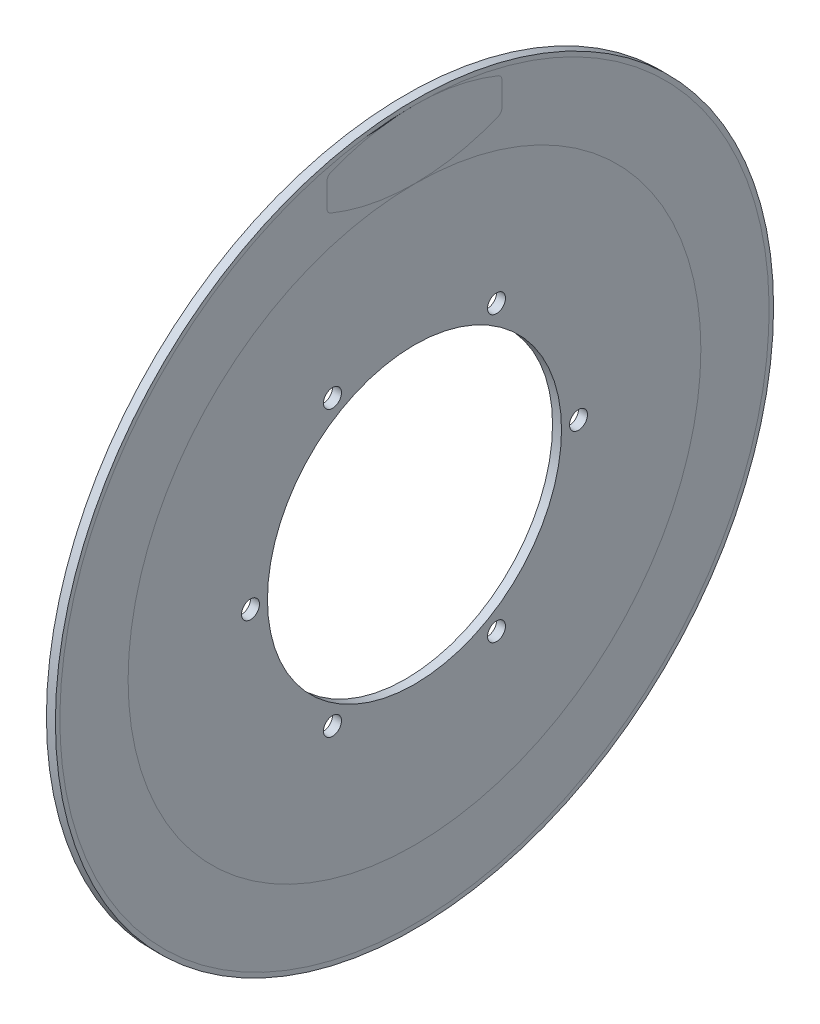
ISO-10303-21;
HEADER;
FILE_DESCRIPTION(('STEP AP214'),'2;1');
FILE_NAME('part.step','',(''),(''),'','','');
FILE_SCHEMA(('AUTOMOTIVE_DESIGN { 1 0 10303 214 1 1 1 1 }'));
ENDSEC;
DATA;
#1=APPLICATION_CONTEXT('core data for automotive mechanical design processes');
#2=APPLICATION_PROTOCOL_DEFINITION('international standard','automotive_design',2000,#1);
#3=PRODUCT_CONTEXT('',#1,'mechanical');
#4=PRODUCT('Part','Part','',(#3));
#5=PRODUCT_RELATED_PRODUCT_CATEGORY('part','',(#4));
#6=PRODUCT_DEFINITION_FORMATION('','',#4);
#7=PRODUCT_DEFINITION_CONTEXT('part definition',#1,'design');
#8=PRODUCT_DEFINITION('design','',#6,#7);
#9=PRODUCT_DEFINITION_SHAPE('','',#8);
#10=(LENGTH_UNIT() NAMED_UNIT(*) SI_UNIT(.MILLI.,.METRE.));
#11=(NAMED_UNIT(*) PLANE_ANGLE_UNIT() SI_UNIT($,.RADIAN.));
#12=(NAMED_UNIT(*) SI_UNIT($,.STERADIAN.) SOLID_ANGLE_UNIT());
#13=UNCERTAINTY_MEASURE_WITH_UNIT(LENGTH_MEASURE(1.E-05),#10,'distance_accuracy_value','');
#14=(GEOMETRIC_REPRESENTATION_CONTEXT(3) GLOBAL_UNCERTAINTY_ASSIGNED_CONTEXT((#13)) GLOBAL_UNIT_ASSIGNED_CONTEXT((#10,
#11,#12)) REPRESENTATION_CONTEXT('',''));
#15=CARTESIAN_POINT('',(0.,0.,0.));
#16=DIRECTION('',(0.,0.,1.));
#17=DIRECTION('',(1.,0.,0.));
#18=AXIS2_PLACEMENT_3D('',#15,#16,#17);
#19=CARTESIAN_POINT('',(0.,0.,0.));
#20=DIRECTION('',(1.,0.,0.));
#21=DIRECTION('',(0.,0.,-1.));
#22=AXIS2_PLACEMENT_3D('',#19,#20,#21);
#23=PLANE('',#22);
#24=CARTESIAN_POINT('',(0.,47.095998697923,0.));
#25=DIRECTION('',(1.,0.,0.));
#26=DIRECTION('',(0.,0.,-1.));
#27=AXIS2_PLACEMENT_3D('',#24,#25,#26);
#28=CIRCLE('',#27,78.316501302077);
#29=CARTESIAN_POINT('',(0.,125.4125,0.));
#30=VERTEX_POINT('',#29);
#31=CARTESIAN_POINT('',(0.,119.577602444939,-29.6629650314785));
#32=VERTEX_POINT('',#31);
#33=EDGE_CURVE('E174',#30,#32,#28,.F.);
#34=ORIENTED_EDGE('',*,*,#33,.F.);
#35=CARTESIAN_POINT('',(0.,0.,0.));
#36=DIRECTION('',(1.,0.,0.));
#37=DIRECTION('',(0.,0.,-1.));
#38=AXIS2_PLACEMENT_3D('',#35,#36,#37);
#39=CIRCLE('',#38,125.4125);
#40=EDGE_CURVE('E72',#30,#30,#39,.F.);
#41=ORIENTED_EDGE('',*,*,#40,.T.);
#42=CARTESIAN_POINT('',(0.,119.577602444939,29.6629650314786));
#43=VERTEX_POINT('',#42);
#44=EDGE_CURVE('E175',#43,#30,#28,.F.);
#45=ORIENTED_EDGE('',*,*,#44,.F.);
#46=CARTESIAN_POINT('',(0.,117.726610511915,28.905449936));
#47=DIRECTION('',(1.,0.,0.));
#48=DIRECTION('',(0.,0.,-1.));
#49=AXIS2_PLACEMENT_3D('',#46,#47,#48);
#50=CIRCLE('',#49,2.000000064);
#51=CARTESIAN_POINT('',(0.,117.726610511915,30.90545));
#52=VERTEX_POINT('',#51);
#53=EDGE_CURVE('E176',#52,#43,#50,.F.);
#54=ORIENTED_EDGE('',*,*,#53,.F.);
#55=DIRECTION('',(0.,1.,0.));
#56=VECTOR('',#55,1.);
#57=CARTESIAN_POINT('',(0.,0.,30.90545));
#58=LINE('',#57,#56);
#59=CARTESIAN_POINT('',(0.,109.019189402164,30.90545));
#60=VERTEX_POINT('',#59);
#61=EDGE_CURVE('E179',#60,#52,#58,.T.);
#62=ORIENTED_EDGE('',*,*,#61,.F.);
#63=CARTESIAN_POINT('',(0.,109.019189402164,28.905449936));
#64=DIRECTION('',(1.,0.,0.));
#65=DIRECTION('',(0.,0.,-1.));
#66=AXIS2_PLACEMENT_3D('',#63,#64,#65);
#67=CIRCLE('',#66,2.00000006400001);
#68=CARTESIAN_POINT('',(0.,107.168197469139,29.6629650314785));
#69=VERTEX_POINT('',#68);
#70=EDGE_CURVE('E183',#69,#60,#67,.F.);
#71=ORIENTED_EDGE('',*,*,#70,.F.);
#72=CARTESIAN_POINT('',(0.,179.649801216155,0.));
#73=DIRECTION('',(1.,0.,0.));
#74=DIRECTION('',(0.,0.,-1.));
#75=AXIS2_PLACEMENT_3D('',#72,#73,#74);
#76=CIRCLE('',#75,78.316501302077);
#77=CARTESIAN_POINT('',(0.,107.168197469139,-29.6629650314785));
#78=VERTEX_POINT('',#77);
#79=EDGE_CURVE('E189',#78,#69,#76,.F.);
#80=ORIENTED_EDGE('',*,*,#79,.F.);
#81=CARTESIAN_POINT('',(0.,109.019189402164,-28.905449936));
#82=DIRECTION('',(1.,0.,0.));
#83=DIRECTION('',(0.,0.,-1.));
#84=AXIS2_PLACEMENT_3D('',#81,#82,#83);
#85=CIRCLE('',#84,2.00000006400001);
#86=CARTESIAN_POINT('',(0.,109.019189402164,-30.90545));
#87=VERTEX_POINT('',#86);
#88=EDGE_CURVE('E195',#87,#78,#85,.F.);
#89=ORIENTED_EDGE('',*,*,#88,.F.);
#90=DIRECTION('',(0.,-1.,0.));
#91=VECTOR('',#90,1.);
#92=CARTESIAN_POINT('',(0.,0.,-30.9054500000001));
#93=LINE('',#92,#91);
#94=CARTESIAN_POINT('',(0.,117.726610511915,-30.90545));
#95=VERTEX_POINT('',#94);
#96=EDGE_CURVE('E134',#95,#87,#93,.T.);
#97=ORIENTED_EDGE('',*,*,#96,.F.);
#98=CARTESIAN_POINT('',(0.,117.726610511915,-28.905449936));
#99=DIRECTION('',(1.,0.,0.));
#100=DIRECTION('',(0.,0.,-1.));
#101=AXIS2_PLACEMENT_3D('',#98,#99,#100);
#102=CIRCLE('',#101,2.00000006400001);
#103=EDGE_CURVE('E169',#32,#95,#102,.F.);
#104=ORIENTED_EDGE('',*,*,#103,.F.);
#105=EDGE_LOOP('',(#34,#41,#45,#54,#62,#71,#80,#89,#97,#104));
#106=FACE_BOUND('',#105,.T.);
#107=CARTESIAN_POINT('',(0.,0.,0.));
#108=DIRECTION('',(1.,0.,0.));
#109=DIRECTION('',(0.,0.,-1.));
#110=AXIS2_PLACEMENT_3D('',#107,#108,#109);
#111=CIRCLE('',#110,101.2825);
#112=CARTESIAN_POINT('',(0.,0.,-101.2825));
#113=VERTEX_POINT('',#112);
#114=EDGE_CURVE('E11',#113,#113,#111,.F.);
#115=ORIENTED_EDGE('',*,*,#114,.F.);
#116=EDGE_LOOP('',(#115));
#117=FACE_BOUND('',#116,.T.);
#118=ADVANCED_FACE('F49',(#106,#117),#23,.F.);
#119=CARTESIAN_POINT('',(3.175,0.,0.));
#120=DIRECTION('',(1.,0.,0.));
#121=DIRECTION('',(0.,0.,-1.));
#122=AXIS2_PLACEMENT_3D('',#119,#120,#121);
#123=PLANE('',#122);
#124=CARTESIAN_POINT('',(3.175,47.095998697923,0.));
#125=DIRECTION('',(1.,0.,0.));
#126=DIRECTION('',(0.,0.,-1.));
#127=AXIS2_PLACEMENT_3D('',#124,#125,#126);
#128=CIRCLE('',#127,78.316501302077);
#129=CARTESIAN_POINT('',(3.175,119.577602444939,29.6629650314786));
#130=VERTEX_POINT('',#129);
#131=CARTESIAN_POINT('',(3.175,125.4125,0.));
#132=VERTEX_POINT('',#131);
#133=EDGE_CURVE('E131',#130,#132,#128,.F.);
#134=ORIENTED_EDGE('',*,*,#133,.T.);
#135=CARTESIAN_POINT('',(3.175,0.,0.));
#136=DIRECTION('',(1.,0.,0.));
#137=DIRECTION('',(0.,0.,-1.));
#138=AXIS2_PLACEMENT_3D('',#135,#136,#137);
#139=CIRCLE('',#138,125.4125);
#140=EDGE_CURVE('E69',#132,#132,#139,.F.);
#141=ORIENTED_EDGE('',*,*,#140,.F.);
#142=CARTESIAN_POINT('',(3.175,119.577602444939,-29.6629650314785));
#143=VERTEX_POINT('',#142);
#144=EDGE_CURVE('E127',#132,#143,#128,.F.);
#145=ORIENTED_EDGE('',*,*,#144,.T.);
#146=CARTESIAN_POINT('',(3.175,117.726610511915,-28.905449936));
#147=DIRECTION('',(1.,0.,0.));
#148=DIRECTION('',(0.,0.,-1.));
#149=AXIS2_PLACEMENT_3D('',#146,#147,#148);
#150=CIRCLE('',#149,2.00000006400001);
#151=CARTESIAN_POINT('',(3.175,117.726610511915,-30.90545));
#152=VERTEX_POINT('',#151);
#153=EDGE_CURVE('E122',#143,#152,#150,.F.);
#154=ORIENTED_EDGE('',*,*,#153,.T.);
#155=DIRECTION('',(0.,-1.,0.));
#156=VECTOR('',#155,1.);
#157=CARTESIAN_POINT('',(3.175,0.,-30.9054500000001));
#158=LINE('',#157,#156);
#159=CARTESIAN_POINT('',(3.175,109.019189402164,-30.90545));
#160=VERTEX_POINT('',#159);
#161=EDGE_CURVE('E126',#152,#160,#158,.T.);
#162=ORIENTED_EDGE('',*,*,#161,.T.);
#163=CARTESIAN_POINT('',(3.175,109.019189402164,-28.905449936));
#164=DIRECTION('',(1.,0.,0.));
#165=DIRECTION('',(0.,0.,-1.));
#166=AXIS2_PLACEMENT_3D('',#163,#164,#165);
#167=CIRCLE('',#166,2.00000006400001);
#168=CARTESIAN_POINT('',(3.175,107.168197469139,-29.6629650314785));
#169=VERTEX_POINT('',#168);
#170=EDGE_CURVE('E132',#160,#169,#167,.F.);
#171=ORIENTED_EDGE('',*,*,#170,.T.);
#172=CARTESIAN_POINT('',(3.175,179.649801216155,0.));
#173=DIRECTION('',(1.,0.,0.));
#174=DIRECTION('',(0.,0.,-1.));
#175=AXIS2_PLACEMENT_3D('',#172,#173,#174);
#176=CIRCLE('',#175,78.316501302077);
#177=CARTESIAN_POINT('',(3.175,107.168197469139,29.6629650314785));
#178=VERTEX_POINT('',#177);
#179=EDGE_CURVE('E141',#169,#178,#176,.F.);
#180=ORIENTED_EDGE('',*,*,#179,.T.);
#181=CARTESIAN_POINT('',(3.175,109.019189402164,28.905449936));
#182=DIRECTION('',(1.,0.,0.));
#183=DIRECTION('',(0.,0.,-1.));
#184=AXIS2_PLACEMENT_3D('',#181,#182,#183);
#185=CIRCLE('',#184,2.00000006400001);
#186=CARTESIAN_POINT('',(3.175,109.019189402164,30.90545));
#187=VERTEX_POINT('',#186);
#188=EDGE_CURVE('E152',#178,#187,#185,.F.);
#189=ORIENTED_EDGE('',*,*,#188,.T.);
#190=DIRECTION('',(0.,1.,0.));
#191=VECTOR('',#190,1.);
#192=CARTESIAN_POINT('',(3.175,0.,30.90545));
#193=LINE('',#192,#191);
#194=CARTESIAN_POINT('',(3.175,117.726610511915,30.90545));
#195=VERTEX_POINT('',#194);
#196=EDGE_CURVE('E158',#187,#195,#193,.T.);
#197=ORIENTED_EDGE('',*,*,#196,.T.);
#198=CARTESIAN_POINT('',(3.175,117.726610511915,28.905449936));
#199=DIRECTION('',(1.,0.,0.));
#200=DIRECTION('',(0.,0.,-1.));
#201=AXIS2_PLACEMENT_3D('',#198,#199,#200);
#202=CIRCLE('',#201,2.000000064);
#203=EDGE_CURVE('E161',#195,#130,#202,.F.);
#204=ORIENTED_EDGE('',*,*,#203,.T.);
#205=EDGE_LOOP('',(#134,#141,#145,#154,#162,#171,#180,#189,#197,#204));
#206=FACE_BOUND('',#205,.T.);
#207=CARTESIAN_POINT('',(3.175,0.,0.));
#208=DIRECTION('',(1.,0.,0.));
#209=DIRECTION('',(0.,0.,-1.));
#210=AXIS2_PLACEMENT_3D('',#207,#208,#209);
#211=CIRCLE('',#210,101.2825);
#212=CARTESIAN_POINT('',(3.175,0.,-101.2825));
#213=VERTEX_POINT('',#212);
#214=EDGE_CURVE('E53',#213,#213,#211,.F.);
#215=ORIENTED_EDGE('',*,*,#214,.T.);
#216=EDGE_LOOP('',(#215));
#217=FACE_BOUND('',#216,.T.);
#218=ADVANCED_FACE('F124',(#206,#217),#123,.T.);
#219=CARTESIAN_POINT('',(0.,0.,0.));
#220=DIRECTION('',(1.,0.,0.));
#221=DIRECTION('',(0.,0.,-1.));
#222=AXIS2_PLACEMENT_3D('',#219,#220,#221);
#223=CIRCLE('',#222,127.);
#224=CARTESIAN_POINT('',(0.,0.,-127.));
#225=VERTEX_POINT('',#224);
#226=EDGE_CURVE('E148',#225,#225,#223,.T.);
#227=ORIENTED_EDGE('',*,*,#226,.F.);
#228=EDGE_LOOP('',(#227));
#229=FACE_BOUND('',#228,.T.);
#230=ORIENTED_EDGE('',*,*,#40,.F.);
#231=EDGE_LOOP('',(#230));
#232=FACE_BOUND('',#231,.T.);
#233=ADVANCED_FACE('F307',(#229,#232),#23,.F.);
#234=CARTESIAN_POINT('',(3.175,0.,0.));
#235=DIRECTION('',(1.,0.,0.));
#236=DIRECTION('',(0.,0.,-1.));
#237=AXIS2_PLACEMENT_3D('',#234,#235,#236);
#238=CIRCLE('',#237,127.);
#239=CARTESIAN_POINT('',(3.175,0.,-127.));
#240=VERTEX_POINT('',#239);
#241=EDGE_CURVE('E140',#240,#240,#238,.T.);
#242=ORIENTED_EDGE('',*,*,#241,.T.);
#243=EDGE_LOOP('',(#242));
#244=FACE_BOUND('',#243,.T.);
#245=ORIENTED_EDGE('',*,*,#140,.T.);
#246=EDGE_LOOP('',(#245));
#247=FACE_BOUND('',#246,.T.);
#248=ADVANCED_FACE('F204',(#244,#247),#123,.T.);
#249=ORIENTED_EDGE('',*,*,#114,.T.);
#250=EDGE_LOOP('',(#249));
#251=FACE_BOUND('',#250,.T.);
#252=CARTESIAN_POINT('',(0.,50.2294734194975,29.));
#253=DIRECTION('',(1.,0.,0.));
#254=DIRECTION('',(0.,0.,-1.));
#255=AXIS2_PLACEMENT_3D('',#252,#253,#254);
#256=CIRCLE('',#255,3.175);
#257=CARTESIAN_POINT('',(0.,50.2294734194975,25.825));
#258=VERTEX_POINT('',#257);
#259=EDGE_CURVE('E285',#258,#258,#256,.T.);
#260=ORIENTED_EDGE('',*,*,#259,.T.);
#261=EDGE_LOOP('',(#260));
#262=FACE_BOUND('',#261,.T.);
#263=CARTESIAN_POINT('',(0.,-50.2294734194974,-29.));
#264=DIRECTION('',(1.,0.,0.));
#265=DIRECTION('',(0.,0.,-1.));
#266=AXIS2_PLACEMENT_3D('',#263,#264,#265);
#267=CIRCLE('',#266,3.175);
#268=CARTESIAN_POINT('',(0.,-50.2294734194974,-32.175));
#269=VERTEX_POINT('',#268);
#270=EDGE_CURVE('E284',#269,#269,#267,.T.);
#271=ORIENTED_EDGE('',*,*,#270,.T.);
#272=EDGE_LOOP('',(#271));
#273=FACE_BOUND('',#272,.T.);
#274=CARTESIAN_POINT('',(0.,-50.2294734194974,29.));
#275=DIRECTION('',(1.,0.,0.));
#276=DIRECTION('',(0.,0.,-1.));
#277=AXIS2_PLACEMENT_3D('',#274,#275,#276);
#278=CIRCLE('',#277,3.175);
#279=CARTESIAN_POINT('',(0.,-50.2294734194974,25.825));
#280=VERTEX_POINT('',#279);
#281=EDGE_CURVE('E277',#280,#280,#278,.T.);
#282=ORIENTED_EDGE('',*,*,#281,.T.);
#283=EDGE_LOOP('',(#282));
#284=FACE_BOUND('',#283,.T.);
#285=CARTESIAN_POINT('',(0.,0.,-58.));
#286=DIRECTION('',(1.,0.,0.));
#287=DIRECTION('',(0.,0.,-1.));
#288=AXIS2_PLACEMENT_3D('',#285,#286,#287);
#289=CIRCLE('',#288,3.175);
#290=CARTESIAN_POINT('',(0.,0.,-61.175));
#291=VERTEX_POINT('',#290);
#292=EDGE_CURVE('E273',#291,#291,#289,.T.);
#293=ORIENTED_EDGE('',*,*,#292,.T.);
#294=EDGE_LOOP('',(#293));
#295=FACE_BOUND('',#294,.T.);
#296=CARTESIAN_POINT('',(0.,0.,58.));
#297=DIRECTION('',(1.,0.,0.));
#298=DIRECTION('',(0.,0.,-1.));
#299=AXIS2_PLACEMENT_3D('',#296,#297,#298);
#300=CIRCLE('',#299,3.175);
#301=CARTESIAN_POINT('',(0.,0.,54.825));
#302=VERTEX_POINT('',#301);
#303=EDGE_CURVE('E275',#302,#302,#300,.T.);
#304=ORIENTED_EDGE('',*,*,#303,.T.);
#305=EDGE_LOOP('',(#304));
#306=FACE_BOUND('',#305,.T.);
#307=CARTESIAN_POINT('',(0.,50.2294734194975,-29.));
#308=DIRECTION('',(1.,0.,0.));
#309=DIRECTION('',(0.,0.,-1.));
#310=AXIS2_PLACEMENT_3D('',#307,#308,#309);
#311=CIRCLE('',#310,3.175);
#312=CARTESIAN_POINT('',(0.,50.2294734194975,-32.175));
#313=VERTEX_POINT('',#312);
#314=EDGE_CURVE('E268',#313,#313,#311,.T.);
#315=ORIENTED_EDGE('',*,*,#314,.T.);
#316=EDGE_LOOP('',(#315));
#317=FACE_BOUND('',#316,.T.);
#318=CARTESIAN_POINT('',(0.,0.,0.));
#319=DIRECTION('',(1.,0.,0.));
#320=DIRECTION('',(0.,0.,-1.));
#321=AXIS2_PLACEMENT_3D('',#318,#319,#320);
#322=CIRCLE('',#321,51.9999999999986);
#323=CARTESIAN_POINT('',(0.,0.,-51.9999999999986));
#324=VERTEX_POINT('',#323);
#325=EDGE_CURVE('E266',#324,#324,#322,.T.);
#326=ORIENTED_EDGE('',*,*,#325,.T.);
#327=EDGE_LOOP('',(#326));
#328=FACE_BOUND('',#327,.T.);
#329=ADVANCED_FACE('F231',(#251,#262,#273,#284,#295,#306,#317,#328),#23,.F.);
#330=ORIENTED_EDGE('',*,*,#214,.F.);
#331=EDGE_LOOP('',(#330));
#332=FACE_BOUND('',#331,.T.);
#333=CARTESIAN_POINT('',(3.175,0.,0.));
#334=DIRECTION('',(1.,0.,0.));
#335=DIRECTION('',(0.,0.,-1.));
#336=AXIS2_PLACEMENT_3D('',#333,#334,#335);
#337=CIRCLE('',#336,51.9999999999986);
#338=CARTESIAN_POINT('',(3.175,0.,-51.9999999999986));
#339=VERTEX_POINT('',#338);
#340=EDGE_CURVE('E238',#339,#339,#337,.T.);
#341=ORIENTED_EDGE('',*,*,#340,.F.);
#342=EDGE_LOOP('',(#341));
#343=FACE_BOUND('',#342,.T.);
#344=CARTESIAN_POINT('',(3.175,50.2294734194975,-29.));
#345=DIRECTION('',(1.,0.,0.));
#346=DIRECTION('',(0.,0.,-1.));
#347=AXIS2_PLACEMENT_3D('',#344,#345,#346);
#348=CIRCLE('',#347,3.175);
#349=CARTESIAN_POINT('',(3.175,50.2294734194975,-32.175));
#350=VERTEX_POINT('',#349);
#351=EDGE_CURVE('E245',#350,#350,#348,.T.);
#352=ORIENTED_EDGE('',*,*,#351,.F.);
#353=EDGE_LOOP('',(#352));
#354=FACE_BOUND('',#353,.T.);
#355=CARTESIAN_POINT('',(3.175,0.,58.));
#356=DIRECTION('',(1.,0.,0.));
#357=DIRECTION('',(0.,0.,-1.));
#358=AXIS2_PLACEMENT_3D('',#355,#356,#357);
#359=CIRCLE('',#358,3.175);
#360=CARTESIAN_POINT('',(3.175,0.,54.825));
#361=VERTEX_POINT('',#360);
#362=EDGE_CURVE('E246',#361,#361,#359,.T.);
#363=ORIENTED_EDGE('',*,*,#362,.F.);
#364=EDGE_LOOP('',(#363));
#365=FACE_BOUND('',#364,.T.);
#366=CARTESIAN_POINT('',(3.175,0.,-58.));
#367=DIRECTION('',(1.,0.,0.));
#368=DIRECTION('',(0.,0.,-1.));
#369=AXIS2_PLACEMENT_3D('',#366,#367,#368);
#370=CIRCLE('',#369,3.175);
#371=CARTESIAN_POINT('',(3.175,0.,-61.175));
#372=VERTEX_POINT('',#371);
#373=EDGE_CURVE('E249',#372,#372,#370,.T.);
#374=ORIENTED_EDGE('',*,*,#373,.F.);
#375=EDGE_LOOP('',(#374));
#376=FACE_BOUND('',#375,.T.);
#377=CARTESIAN_POINT('',(3.175,-50.2294734194974,29.));
#378=DIRECTION('',(1.,0.,0.));
#379=DIRECTION('',(0.,0.,-1.));
#380=AXIS2_PLACEMENT_3D('',#377,#378,#379);
#381=CIRCLE('',#380,3.175);
#382=CARTESIAN_POINT('',(3.175,-50.2294734194974,25.825));
#383=VERTEX_POINT('',#382);
#384=EDGE_CURVE('E251',#383,#383,#381,.T.);
#385=ORIENTED_EDGE('',*,*,#384,.F.);
#386=EDGE_LOOP('',(#385));
#387=FACE_BOUND('',#386,.T.);
#388=CARTESIAN_POINT('',(3.175,-50.2294734194974,-29.));
#389=DIRECTION('',(1.,0.,0.));
#390=DIRECTION('',(0.,0.,-1.));
#391=AXIS2_PLACEMENT_3D('',#388,#389,#390);
#392=CIRCLE('',#391,3.175);
#393=CARTESIAN_POINT('',(3.175,-50.2294734194974,-32.175));
#394=VERTEX_POINT('',#393);
#395=EDGE_CURVE('E257',#394,#394,#392,.T.);
#396=ORIENTED_EDGE('',*,*,#395,.F.);
#397=EDGE_LOOP('',(#396));
#398=FACE_BOUND('',#397,.T.);
#399=CARTESIAN_POINT('',(3.175,50.2294734194975,29.));
#400=DIRECTION('',(1.,0.,0.));
#401=DIRECTION('',(0.,0.,-1.));
#402=AXIS2_PLACEMENT_3D('',#399,#400,#401);
#403=CIRCLE('',#402,3.175);
#404=CARTESIAN_POINT('',(3.175,50.2294734194975,25.825));
#405=VERTEX_POINT('',#404);
#406=EDGE_CURVE('E146',#405,#405,#403,.T.);
#407=ORIENTED_EDGE('',*,*,#406,.F.);
#408=EDGE_LOOP('',(#407));
#409=FACE_BOUND('',#408,.T.);
#410=ADVANCED_FACE('F230',(#332,#343,#354,#365,#376,#387,#398,#409),#123,.T.);
#411=CARTESIAN_POINT('',(3.175,50.2294734194975,29.));
#412=DIRECTION('',(-1.,0.,0.));
#413=DIRECTION('',(0.,0.,1.));
#414=AXIS2_PLACEMENT_3D('',#411,#412,#413);
#415=CYLINDRICAL_SURFACE('',#414,3.175);
#416=ORIENTED_EDGE('',*,*,#406,.T.);
#417=EDGE_LOOP('',(#416));
#418=FACE_BOUND('',#417,.T.);
#419=ORIENTED_EDGE('',*,*,#259,.F.);
#420=EDGE_LOOP('',(#419));
#421=FACE_BOUND('',#420,.T.);
#422=ADVANCED_FACE('F235',(#418,#421),#415,.F.);
#423=CARTESIAN_POINT('',(3.175,-50.2294734194974,-29.));
#424=DIRECTION('',(-1.,0.,0.));
#425=DIRECTION('',(0.,0.,1.));
#426=AXIS2_PLACEMENT_3D('',#423,#424,#425);
#427=CYLINDRICAL_SURFACE('',#426,3.175);
#428=ORIENTED_EDGE('',*,*,#395,.T.);
#429=EDGE_LOOP('',(#428));
#430=FACE_BOUND('',#429,.T.);
#431=ORIENTED_EDGE('',*,*,#270,.F.);
#432=EDGE_LOOP('',(#431));
#433=FACE_BOUND('',#432,.T.);
#434=ADVANCED_FACE('F297',(#430,#433),#427,.F.);
#435=CARTESIAN_POINT('',(3.175,-50.2294734194974,29.));
#436=DIRECTION('',(-1.,0.,0.));
#437=DIRECTION('',(0.,0.,1.));
#438=AXIS2_PLACEMENT_3D('',#435,#436,#437);
#439=CYLINDRICAL_SURFACE('',#438,3.175);
#440=ORIENTED_EDGE('',*,*,#384,.T.);
#441=EDGE_LOOP('',(#440));
#442=FACE_BOUND('',#441,.T.);
#443=ORIENTED_EDGE('',*,*,#281,.F.);
#444=EDGE_LOOP('',(#443));
#445=FACE_BOUND('',#444,.T.);
#446=ADVANCED_FACE('F298',(#442,#445),#439,.F.);
#447=CARTESIAN_POINT('',(3.175,0.,-58.));
#448=DIRECTION('',(-1.,0.,0.));
#449=DIRECTION('',(0.,0.,1.));
#450=AXIS2_PLACEMENT_3D('',#447,#448,#449);
#451=CYLINDRICAL_SURFACE('',#450,3.175);
#452=ORIENTED_EDGE('',*,*,#373,.T.);
#453=EDGE_LOOP('',(#452));
#454=FACE_BOUND('',#453,.T.);
#455=ORIENTED_EDGE('',*,*,#292,.F.);
#456=EDGE_LOOP('',(#455));
#457=FACE_BOUND('',#456,.T.);
#458=ADVANCED_FACE('F299',(#454,#457),#451,.F.);
#459=CARTESIAN_POINT('',(3.175,0.,58.));
#460=DIRECTION('',(-1.,0.,0.));
#461=DIRECTION('',(0.,0.,1.));
#462=AXIS2_PLACEMENT_3D('',#459,#460,#461);
#463=CYLINDRICAL_SURFACE('',#462,3.175);
#464=ORIENTED_EDGE('',*,*,#362,.T.);
#465=EDGE_LOOP('',(#464));
#466=FACE_BOUND('',#465,.T.);
#467=ORIENTED_EDGE('',*,*,#303,.F.);
#468=EDGE_LOOP('',(#467));
#469=FACE_BOUND('',#468,.T.);
#470=ADVANCED_FACE('F326',(#466,#469),#463,.F.);
#471=CARTESIAN_POINT('',(3.175,50.2294734194975,-29.));
#472=DIRECTION('',(-1.,0.,0.));
#473=DIRECTION('',(0.,0.,1.));
#474=AXIS2_PLACEMENT_3D('',#471,#472,#473);
#475=CYLINDRICAL_SURFACE('',#474,3.175);
#476=ORIENTED_EDGE('',*,*,#351,.T.);
#477=EDGE_LOOP('',(#476));
#478=FACE_BOUND('',#477,.T.);
#479=ORIENTED_EDGE('',*,*,#314,.F.);
#480=EDGE_LOOP('',(#479));
#481=FACE_BOUND('',#480,.T.);
#482=ADVANCED_FACE('F318',(#478,#481),#475,.F.);
#483=CARTESIAN_POINT('',(3.175,0.,0.));
#484=DIRECTION('',(-1.,0.,0.));
#485=DIRECTION('',(0.,0.,1.));
#486=AXIS2_PLACEMENT_3D('',#483,#484,#485);
#487=CYLINDRICAL_SURFACE('',#486,51.9999999999986);
#488=ORIENTED_EDGE('',*,*,#340,.T.);
#489=EDGE_LOOP('',(#488));
#490=FACE_BOUND('',#489,.T.);
#491=ORIENTED_EDGE('',*,*,#325,.F.);
#492=EDGE_LOOP('',(#491));
#493=FACE_BOUND('',#492,.T.);
#494=ADVANCED_FACE('F55',(#490,#493),#487,.F.);
#495=CARTESIAN_POINT('',(3.175,0.,0.));
#496=DIRECTION('',(-1.,0.,0.));
#497=DIRECTION('',(0.,0.,1.));
#498=AXIS2_PLACEMENT_3D('',#495,#496,#497);
#499=CYLINDRICAL_SURFACE('',#498,127.);
#500=ORIENTED_EDGE('',*,*,#241,.F.);
#501=EDGE_LOOP('',(#500));
#502=FACE_BOUND('',#501,.T.);
#503=ORIENTED_EDGE('',*,*,#226,.T.);
#504=EDGE_LOOP('',(#503));
#505=FACE_BOUND('',#504,.T.);
#506=ADVANCED_FACE('F316',(#502,#505),#499,.T.);
#507=ORIENTED_EDGE('',*,*,#153,.F.);
#508=ORIENTED_EDGE('',*,*,#144,.F.);
#509=ORIENTED_EDGE('',*,*,#133,.F.);
#510=ORIENTED_EDGE('',*,*,#203,.F.);
#511=ORIENTED_EDGE('',*,*,#196,.F.);
#512=ORIENTED_EDGE('',*,*,#188,.F.);
#513=ORIENTED_EDGE('',*,*,#179,.F.);
#514=ORIENTED_EDGE('',*,*,#170,.F.);
#515=ORIENTED_EDGE('',*,*,#161,.F.);
#516=EDGE_LOOP('',(#507,#508,#509,#510,#511,#512,#513,#514,#515));
#517=FACE_BOUND('',#516,.T.);
#518=ADVANCED_FACE('F133',(#517),#123,.T.);
#519=ORIENTED_EDGE('',*,*,#44,.T.);
#520=ORIENTED_EDGE('',*,*,#33,.T.);
#521=ORIENTED_EDGE('',*,*,#103,.T.);
#522=ORIENTED_EDGE('',*,*,#96,.T.);
#523=ORIENTED_EDGE('',*,*,#88,.T.);
#524=ORIENTED_EDGE('',*,*,#79,.T.);
#525=ORIENTED_EDGE('',*,*,#70,.T.);
#526=ORIENTED_EDGE('',*,*,#61,.T.);
#527=ORIENTED_EDGE('',*,*,#53,.T.);
#528=EDGE_LOOP('',(#519,#520,#521,#522,#523,#524,#525,#526,#527));
#529=FACE_BOUND('',#528,.T.);
#530=ADVANCED_FACE('F308',(#529),#23,.F.);
#531=CLOSED_SHELL('',(#118,#218,#233,#248,#329,#410,#422,#434,#446,#458,#470,#482,#494,#506,
#518,#530));
#532=MANIFOLD_SOLID_BREP('B2',#531);
#533=ADVANCED_BREP_SHAPE_REPRESENTATION('',(#18,#532),#14);
#534=SHAPE_DEFINITION_REPRESENTATION(#9,#533);
ENDSEC;
END-ISO-10303-21;
